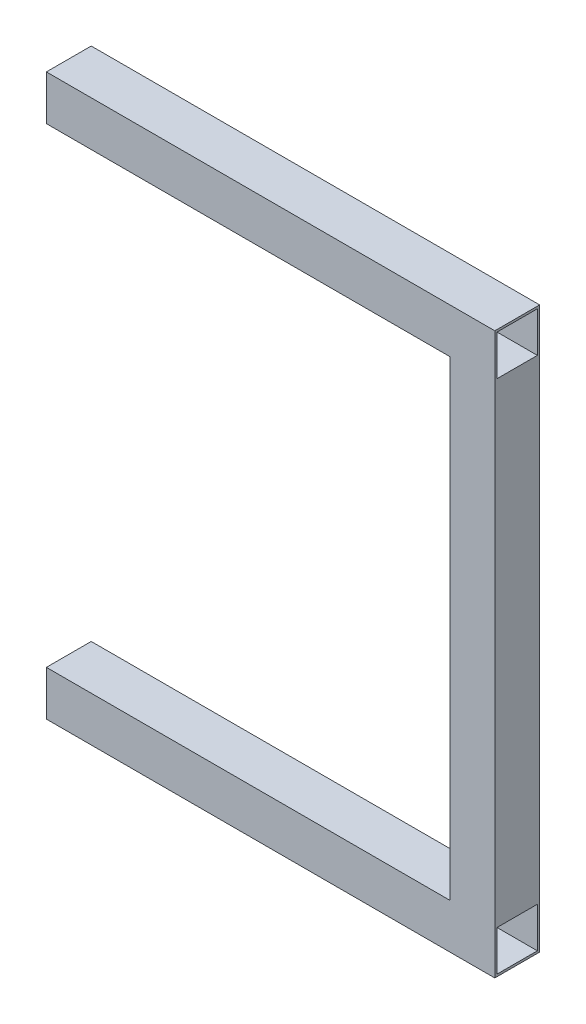
ISO-10303-21;
HEADER;
FILE_DESCRIPTION(('STEP AP214'),'2;1');
FILE_NAME('part.step','',(''),(''),'','','');
FILE_SCHEMA(('AUTOMOTIVE_DESIGN { 1 0 10303 214 1 1 1 1 }'));
ENDSEC;
DATA;
#1=APPLICATION_CONTEXT('core data for automotive mechanical design processes');
#2=APPLICATION_PROTOCOL_DEFINITION('international standard','automotive_design',2000,#1);
#3=PRODUCT_CONTEXT('',#1,'mechanical');
#4=PRODUCT('Part','Part','',(#3));
#5=PRODUCT_RELATED_PRODUCT_CATEGORY('part','',(#4));
#6=PRODUCT_DEFINITION_FORMATION('','',#4);
#7=PRODUCT_DEFINITION_CONTEXT('part definition',#1,'design');
#8=PRODUCT_DEFINITION('design','',#6,#7);
#9=PRODUCT_DEFINITION_SHAPE('','',#8);
#10=(LENGTH_UNIT() NAMED_UNIT(*) SI_UNIT(.MILLI.,.METRE.));
#11=(NAMED_UNIT(*) PLANE_ANGLE_UNIT() SI_UNIT($,.RADIAN.));
#12=(NAMED_UNIT(*) SI_UNIT($,.STERADIAN.) SOLID_ANGLE_UNIT());
#13=UNCERTAINTY_MEASURE_WITH_UNIT(LENGTH_MEASURE(1.E-05),#10,'distance_accuracy_value','');
#14=(GEOMETRIC_REPRESENTATION_CONTEXT(3) GLOBAL_UNCERTAINTY_ASSIGNED_CONTEXT((#13)) GLOBAL_UNIT_ASSIGNED_CONTEXT((#10,
#11,#12)) REPRESENTATION_CONTEXT('',''));
#15=CARTESIAN_POINT('',(0.,0.,0.));
#16=DIRECTION('',(0.,0.,1.));
#17=DIRECTION('',(1.,0.,0.));
#18=AXIS2_PLACEMENT_3D('',#15,#16,#17);
#19=CARTESIAN_POINT('',(400.000000000002,0.,40.));
#20=DIRECTION('',(0.,1.,0.));
#21=DIRECTION('',(0.,0.,1.));
#22=AXIS2_PLACEMENT_3D('',#19,#20,#21);
#23=PLANE('',#22);
#24=DIRECTION('',(1.,0.,0.));
#25=VECTOR('',#24,1.);
#26=CARTESIAN_POINT('',(400.000000000002,0.,0.));
#27=LINE('',#26,#25);
#28=CARTESIAN_POINT('',(0.,0.,0.));
#29=VERTEX_POINT('',#28);
#30=CARTESIAN_POINT('',(400.000000000002,0.,0.));
#31=VERTEX_POINT('',#30);
#32=EDGE_CURVE('E214',#29,#31,#27,.T.);
#33=ORIENTED_EDGE('',*,*,#32,.T.);
#34=DIRECTION('',(0.,0.,-1.));
#35=VECTOR('',#34,1.);
#36=CARTESIAN_POINT('',(400.000000000002,0.,40.));
#37=LINE('',#36,#35);
#38=CARTESIAN_POINT('',(400.000000000002,0.,40.));
#39=VERTEX_POINT('',#38);
#40=EDGE_CURVE('E11',#39,#31,#37,.T.);
#41=ORIENTED_EDGE('',*,*,#40,.F.);
#42=DIRECTION('',(1.,0.,0.));
#43=VECTOR('',#42,1.);
#44=CARTESIAN_POINT('',(400.000000000002,0.,40.));
#45=LINE('',#44,#43);
#46=CARTESIAN_POINT('',(0.,0.,40.));
#47=VERTEX_POINT('',#46);
#48=EDGE_CURVE('E215',#47,#39,#45,.T.);
#49=ORIENTED_EDGE('',*,*,#48,.F.);
#50=DIRECTION('',(0.,0.,-1.));
#51=VECTOR('',#50,1.);
#52=CARTESIAN_POINT('',(0.,0.,40.));
#53=LINE('',#52,#51);
#54=EDGE_CURVE('E233',#47,#29,#53,.T.);
#55=ORIENTED_EDGE('',*,*,#54,.T.);
#56=EDGE_LOOP('',(#33,#41,#49,#55));
#57=FACE_BOUND('',#56,.T.);
#58=ADVANCED_FACE('F33',(#57),#23,.F.);
#59=CARTESIAN_POINT('',(400.,500.,40.));
#60=DIRECTION('',(-1.,0.,0.));
#61=DIRECTION('',(0.,-1.,0.));
#62=AXIS2_PLACEMENT_3D('',#59,#60,#61);
#63=PLANE('',#62);
#64=DIRECTION('',(0.,0.,-1.));
#65=VECTOR('',#64,1.);
#66=CARTESIAN_POINT('',(400.000000000002,38.,40.));
#67=LINE('',#66,#65);
#68=CARTESIAN_POINT('',(400.000000000002,38.,38.));
#69=VERTEX_POINT('',#68);
#70=CARTESIAN_POINT('',(400.000000000002,38.,2.));
#71=VERTEX_POINT('',#70);
#72=EDGE_CURVE('E176',#69,#71,#67,.T.);
#73=ORIENTED_EDGE('',*,*,#72,.T.);
#74=DIRECTION('',(0.,-1.,0.));
#75=VECTOR('',#74,1.);
#76=CARTESIAN_POINT('',(400.,500.,1.99999999999995));
#77=LINE('',#76,#75);
#78=CARTESIAN_POINT('',(400.000000000002,2.,2.));
#79=VERTEX_POINT('',#78);
#80=EDGE_CURVE('E179',#71,#79,#77,.T.);
#81=ORIENTED_EDGE('',*,*,#80,.T.);
#82=DIRECTION('',(0.,0.,1.));
#83=VECTOR('',#82,1.);
#84=CARTESIAN_POINT('',(400.000000000002,2.,40.));
#85=LINE('',#84,#83);
#86=CARTESIAN_POINT('',(400.000000000002,2.,38.));
#87=VERTEX_POINT('',#86);
#88=EDGE_CURVE('E171',#79,#87,#85,.T.);
#89=ORIENTED_EDGE('',*,*,#88,.T.);
#90=DIRECTION('',(0.,1.,0.));
#91=VECTOR('',#90,1.);
#92=CARTESIAN_POINT('',(400.,500.,37.9999999999999));
#93=LINE('',#92,#91);
#94=EDGE_CURVE('E151',#87,#69,#93,.T.);
#95=ORIENTED_EDGE('',*,*,#94,.T.);
#96=EDGE_LOOP('',(#73,#81,#89,#95));
#97=FACE_BOUND('',#96,.T.);
#98=DIRECTION('',(0.,0.,-1.));
#99=VECTOR('',#98,1.);
#100=CARTESIAN_POINT('',(400.,498.,40.));
#101=LINE('',#100,#99);
#102=CARTESIAN_POINT('',(400.,498.,38.));
#103=VERTEX_POINT('',#102);
#104=CARTESIAN_POINT('',(400.,498.,2.));
#105=VERTEX_POINT('',#104);
#106=EDGE_CURVE('E208',#103,#105,#101,.T.);
#107=ORIENTED_EDGE('',*,*,#106,.T.);
#108=DIRECTION('',(0.,-1.,0.));
#109=VECTOR('',#108,1.);
#110=CARTESIAN_POINT('',(400.,500.,2.));
#111=LINE('',#110,#109);
#112=CARTESIAN_POINT('',(400.,462.,2.));
#113=VERTEX_POINT('',#112);
#114=EDGE_CURVE('E211',#105,#113,#111,.T.);
#115=ORIENTED_EDGE('',*,*,#114,.T.);
#116=DIRECTION('',(0.,0.,1.));
#117=VECTOR('',#116,1.);
#118=CARTESIAN_POINT('',(400.,462.,40.));
#119=LINE('',#118,#117);
#120=CARTESIAN_POINT('',(400.,462.,38.));
#121=VERTEX_POINT('',#120);
#122=EDGE_CURVE('E196',#113,#121,#119,.T.);
#123=ORIENTED_EDGE('',*,*,#122,.T.);
#124=DIRECTION('',(0.,1.,0.));
#125=VECTOR('',#124,1.);
#126=CARTESIAN_POINT('',(400.,500.,38.));
#127=LINE('',#126,#125);
#128=EDGE_CURVE('E205',#121,#103,#127,.T.);
#129=ORIENTED_EDGE('',*,*,#128,.T.);
#130=EDGE_LOOP('',(#107,#115,#123,#129));
#131=FACE_BOUND('',#130,.T.);
#132=DIRECTION('',(0.,1.,0.));
#133=VECTOR('',#132,1.);
#134=CARTESIAN_POINT('',(400.,500.,0.));
#135=LINE('',#134,#133);
#136=CARTESIAN_POINT('',(400.,500.,0.));
#137=VERTEX_POINT('',#136);
#138=EDGE_CURVE('E236',#31,#137,#135,.T.);
#139=ORIENTED_EDGE('',*,*,#138,.T.);
#140=DIRECTION('',(0.,0.,-1.));
#141=VECTOR('',#140,1.);
#142=CARTESIAN_POINT('',(400.,500.,40.));
#143=LINE('',#142,#141);
#144=CARTESIAN_POINT('',(400.,500.,40.));
#145=VERTEX_POINT('',#144);
#146=EDGE_CURVE('E40',#145,#137,#143,.T.);
#147=ORIENTED_EDGE('',*,*,#146,.F.);
#148=DIRECTION('',(0.,1.,0.));
#149=VECTOR('',#148,1.);
#150=CARTESIAN_POINT('',(400.,500.,40.));
#151=LINE('',#150,#149);
#152=EDGE_CURVE('E218',#39,#145,#151,.T.);
#153=ORIENTED_EDGE('',*,*,#152,.F.);
#154=ORIENTED_EDGE('',*,*,#40,.T.);
#155=EDGE_LOOP('',(#139,#147,#153,#154));
#156=FACE_BOUND('',#155,.T.);
#157=ADVANCED_FACE('F293',(#97,#131,#156),#63,.F.);
#158=CARTESIAN_POINT('',(0.,500.,40.));
#159=DIRECTION('',(0.,-1.,0.));
#160=DIRECTION('',(0.,0.,-1.));
#161=AXIS2_PLACEMENT_3D('',#158,#159,#160);
#162=PLANE('',#161);
#163=DIRECTION('',(-1.,0.,0.));
#164=VECTOR('',#163,1.);
#165=CARTESIAN_POINT('',(0.,500.,0.));
#166=LINE('',#165,#164);
#167=CARTESIAN_POINT('',(0.,500.,0.));
#168=VERTEX_POINT('',#167);
#169=EDGE_CURVE('E238',#137,#168,#166,.T.);
#170=ORIENTED_EDGE('',*,*,#169,.T.);
#171=DIRECTION('',(0.,0.,-1.));
#172=VECTOR('',#171,1.);
#173=CARTESIAN_POINT('',(0.,500.,40.));
#174=LINE('',#173,#172);
#175=CARTESIAN_POINT('',(0.,500.,40.));
#176=VERTEX_POINT('',#175);
#177=EDGE_CURVE('E263',#176,#168,#174,.T.);
#178=ORIENTED_EDGE('',*,*,#177,.F.);
#179=DIRECTION('',(-1.,0.,0.));
#180=VECTOR('',#179,1.);
#181=CARTESIAN_POINT('',(0.,500.,40.));
#182=LINE('',#181,#180);
#183=EDGE_CURVE('E221',#145,#176,#182,.T.);
#184=ORIENTED_EDGE('',*,*,#183,.F.);
#185=ORIENTED_EDGE('',*,*,#146,.T.);
#186=EDGE_LOOP('',(#170,#178,#184,#185));
#187=FACE_BOUND('',#186,.T.);
#188=ADVANCED_FACE('F270',(#187),#162,.F.);
#189=CARTESIAN_POINT('',(0.,460.,40.));
#190=DIRECTION('',(1.,0.,0.));
#191=DIRECTION('',(0.,0.,-1.));
#192=AXIS2_PLACEMENT_3D('',#189,#190,#191);
#193=PLANE('',#192);
#194=DIRECTION('',(0.,0.,1.));
#195=VECTOR('',#194,1.);
#196=CARTESIAN_POINT('',(0.,462.,2.));
#197=LINE('',#196,#195);
#198=CARTESIAN_POINT('',(0.,462.,2.00000000000001));
#199=VERTEX_POINT('',#198);
#200=CARTESIAN_POINT('',(0.,462.,38.));
#201=VERTEX_POINT('',#200);
#202=EDGE_CURVE('E184',#199,#201,#197,.T.);
#203=ORIENTED_EDGE('',*,*,#202,.F.);
#204=DIRECTION('',(0.,-1.,0.));
#205=VECTOR('',#204,1.);
#206=CARTESIAN_POINT('',(0.,498.,2.));
#207=LINE('',#206,#205);
#208=CARTESIAN_POINT('',(0.,498.,2.));
#209=VERTEX_POINT('',#208);
#210=EDGE_CURVE('E182',#209,#199,#207,.T.);
#211=ORIENTED_EDGE('',*,*,#210,.F.);
#212=DIRECTION('',(0.,0.,-1.));
#213=VECTOR('',#212,1.);
#214=CARTESIAN_POINT('',(0.,498.,2.));
#215=LINE('',#214,#213);
#216=CARTESIAN_POINT('',(0.,498.,38.));
#217=VERTEX_POINT('',#216);
#218=EDGE_CURVE('E190',#217,#209,#215,.T.);
#219=ORIENTED_EDGE('',*,*,#218,.F.);
#220=DIRECTION('',(0.,1.,0.));
#221=VECTOR('',#220,1.);
#222=CARTESIAN_POINT('',(0.,498.,38.));
#223=LINE('',#222,#221);
#224=EDGE_CURVE('E187',#201,#217,#223,.T.);
#225=ORIENTED_EDGE('',*,*,#224,.F.);
#226=EDGE_LOOP('',(#203,#211,#219,#225));
#227=FACE_BOUND('',#226,.T.);
#228=DIRECTION('',(0.,-1.,0.));
#229=VECTOR('',#228,1.);
#230=CARTESIAN_POINT('',(0.,460.,0.));
#231=LINE('',#230,#229);
#232=CARTESIAN_POINT('',(0.,460.,0.));
#233=VERTEX_POINT('',#232);
#234=EDGE_CURVE('E240',#168,#233,#231,.T.);
#235=ORIENTED_EDGE('',*,*,#234,.T.);
#236=DIRECTION('',(0.,0.,-1.));
#237=VECTOR('',#236,1.);
#238=CARTESIAN_POINT('',(0.,460.,40.));
#239=LINE('',#238,#237);
#240=CARTESIAN_POINT('',(0.,460.,40.));
#241=VERTEX_POINT('',#240);
#242=EDGE_CURVE('E260',#241,#233,#239,.T.);
#243=ORIENTED_EDGE('',*,*,#242,.F.);
#244=DIRECTION('',(0.,-1.,0.));
#245=VECTOR('',#244,1.);
#246=CARTESIAN_POINT('',(0.,460.,40.));
#247=LINE('',#246,#245);
#248=EDGE_CURVE('E223',#176,#241,#247,.T.);
#249=ORIENTED_EDGE('',*,*,#248,.F.);
#250=ORIENTED_EDGE('',*,*,#177,.T.);
#251=EDGE_LOOP('',(#235,#243,#249,#250));
#252=FACE_BOUND('',#251,.T.);
#253=ADVANCED_FACE('F281',(#227,#252),#193,.F.);
#254=CARTESIAN_POINT('',(360.,460.,40.));
#255=DIRECTION('',(0.,1.,0.));
#256=DIRECTION('',(0.,0.,1.));
#257=AXIS2_PLACEMENT_3D('',#254,#255,#256);
#258=PLANE('',#257);
#259=DIRECTION('',(1.,0.,0.));
#260=VECTOR('',#259,1.);
#261=CARTESIAN_POINT('',(360.,460.,0.));
#262=LINE('',#261,#260);
#263=CARTESIAN_POINT('',(360.,460.,0.));
#264=VERTEX_POINT('',#263);
#265=EDGE_CURVE('E242',#233,#264,#262,.T.);
#266=ORIENTED_EDGE('',*,*,#265,.T.);
#267=DIRECTION('',(0.,0.,-1.));
#268=VECTOR('',#267,1.);
#269=CARTESIAN_POINT('',(360.,460.,40.));
#270=LINE('',#269,#268);
#271=CARTESIAN_POINT('',(360.,460.,40.));
#272=VERTEX_POINT('',#271);
#273=EDGE_CURVE('E257',#272,#264,#270,.T.);
#274=ORIENTED_EDGE('',*,*,#273,.F.);
#275=DIRECTION('',(1.,0.,0.));
#276=VECTOR('',#275,1.);
#277=CARTESIAN_POINT('',(360.,460.,40.));
#278=LINE('',#277,#276);
#279=EDGE_CURVE('E225',#241,#272,#278,.T.);
#280=ORIENTED_EDGE('',*,*,#279,.F.);
#281=ORIENTED_EDGE('',*,*,#242,.T.);
#282=EDGE_LOOP('',(#266,#274,#280,#281));
#283=FACE_BOUND('',#282,.T.);
#284=ADVANCED_FACE('F285',(#283),#258,.F.);
#285=CARTESIAN_POINT('',(360.000000000002,40.,40.));
#286=DIRECTION('',(1.,0.,0.));
#287=DIRECTION('',(0.,1.,0.));
#288=AXIS2_PLACEMENT_3D('',#285,#286,#287);
#289=PLANE('',#288);
#290=DIRECTION('',(0.,-1.,0.));
#291=VECTOR('',#290,1.);
#292=CARTESIAN_POINT('',(360.000000000002,40.,0.));
#293=LINE('',#292,#291);
#294=CARTESIAN_POINT('',(360.000000000002,40.,0.));
#295=VERTEX_POINT('',#294);
#296=EDGE_CURVE('E244',#264,#295,#293,.T.);
#297=ORIENTED_EDGE('',*,*,#296,.T.);
#298=DIRECTION('',(0.,0.,-1.));
#299=VECTOR('',#298,1.);
#300=CARTESIAN_POINT('',(360.000000000002,40.,40.));
#301=LINE('',#300,#299);
#302=CARTESIAN_POINT('',(360.000000000002,40.,40.));
#303=VERTEX_POINT('',#302);
#304=EDGE_CURVE('E254',#303,#295,#301,.T.);
#305=ORIENTED_EDGE('',*,*,#304,.F.);
#306=DIRECTION('',(0.,-1.,0.));
#307=VECTOR('',#306,1.);
#308=CARTESIAN_POINT('',(360.000000000002,40.,40.));
#309=LINE('',#308,#307);
#310=EDGE_CURVE('E227',#272,#303,#309,.T.);
#311=ORIENTED_EDGE('',*,*,#310,.F.);
#312=ORIENTED_EDGE('',*,*,#273,.T.);
#313=EDGE_LOOP('',(#297,#305,#311,#312));
#314=FACE_BOUND('',#313,.T.);
#315=ADVANCED_FACE('F304',(#314),#289,.F.);
#316=CARTESIAN_POINT('',(0.,40.,40.));
#317=DIRECTION('',(0.,-1.,0.));
#318=DIRECTION('',(1.,0.,0.));
#319=AXIS2_PLACEMENT_3D('',#316,#317,#318);
#320=PLANE('',#319);
#321=DIRECTION('',(-1.,0.,0.));
#322=VECTOR('',#321,1.);
#323=CARTESIAN_POINT('',(0.,40.,0.));
#324=LINE('',#323,#322);
#325=CARTESIAN_POINT('',(0.,40.,0.));
#326=VERTEX_POINT('',#325);
#327=EDGE_CURVE('E246',#295,#326,#324,.T.);
#328=ORIENTED_EDGE('',*,*,#327,.T.);
#329=DIRECTION('',(0.,0.,-1.));
#330=VECTOR('',#329,1.);
#331=CARTESIAN_POINT('',(0.,40.,40.));
#332=LINE('',#331,#330);
#333=CARTESIAN_POINT('',(0.,40.,40.));
#334=VERTEX_POINT('',#333);
#335=EDGE_CURVE('E251',#334,#326,#332,.T.);
#336=ORIENTED_EDGE('',*,*,#335,.F.);
#337=DIRECTION('',(-1.,0.,0.));
#338=VECTOR('',#337,1.);
#339=CARTESIAN_POINT('',(0.,40.,40.));
#340=LINE('',#339,#338);
#341=EDGE_CURVE('E229',#303,#334,#340,.T.);
#342=ORIENTED_EDGE('',*,*,#341,.F.);
#343=ORIENTED_EDGE('',*,*,#304,.T.);
#344=EDGE_LOOP('',(#328,#336,#342,#343));
#345=FACE_BOUND('',#344,.T.);
#346=ADVANCED_FACE('F302',(#345),#320,.F.);
#347=CARTESIAN_POINT('',(0.,0.,40.));
#348=DIRECTION('',(1.,0.,0.));
#349=DIRECTION('',(0.,0.,-1.));
#350=AXIS2_PLACEMENT_3D('',#347,#348,#349);
#351=PLANE('',#350);
#352=DIRECTION('',(0.,0.,1.));
#353=VECTOR('',#352,1.);
#354=CARTESIAN_POINT('',(0.,2.,2.));
#355=LINE('',#354,#353);
#356=CARTESIAN_POINT('',(0.,2.,2.00000000000001));
#357=VERTEX_POINT('',#356);
#358=CARTESIAN_POINT('',(0.,2.,38.));
#359=VERTEX_POINT('',#358);
#360=EDGE_CURVE('E157',#357,#359,#355,.T.);
#361=ORIENTED_EDGE('',*,*,#360,.F.);
#362=DIRECTION('',(0.,-1.,0.));
#363=VECTOR('',#362,1.);
#364=CARTESIAN_POINT('',(0.,38.,2.));
#365=LINE('',#364,#363);
#366=CARTESIAN_POINT('',(0.,38.,2.));
#367=VERTEX_POINT('',#366);
#368=EDGE_CURVE('E55',#367,#357,#365,.T.);
#369=ORIENTED_EDGE('',*,*,#368,.F.);
#370=DIRECTION('',(0.,0.,-1.));
#371=VECTOR('',#370,1.);
#372=CARTESIAN_POINT('',(0.,38.,2.));
#373=LINE('',#372,#371);
#374=CARTESIAN_POINT('',(0.,38.,38.));
#375=VERTEX_POINT('',#374);
#376=EDGE_CURVE('E164',#375,#367,#373,.T.);
#377=ORIENTED_EDGE('',*,*,#376,.F.);
#378=DIRECTION('',(0.,1.,0.));
#379=VECTOR('',#378,1.);
#380=CARTESIAN_POINT('',(0.,38.,38.));
#381=LINE('',#380,#379);
#382=EDGE_CURVE('E148',#359,#375,#381,.T.);
#383=ORIENTED_EDGE('',*,*,#382,.F.);
#384=EDGE_LOOP('',(#361,#369,#377,#383));
#385=FACE_BOUND('',#384,.T.);
#386=DIRECTION('',(0.,-1.,0.));
#387=VECTOR('',#386,1.);
#388=CARTESIAN_POINT('',(0.,0.,0.));
#389=LINE('',#388,#387);
#390=EDGE_CURVE('E219',#326,#29,#389,.T.);
#391=ORIENTED_EDGE('',*,*,#390,.T.);
#392=ORIENTED_EDGE('',*,*,#54,.F.);
#393=DIRECTION('',(0.,-1.,0.));
#394=VECTOR('',#393,1.);
#395=CARTESIAN_POINT('',(0.,0.,40.));
#396=LINE('',#395,#394);
#397=EDGE_CURVE('E231',#334,#47,#396,.T.);
#398=ORIENTED_EDGE('',*,*,#397,.F.);
#399=ORIENTED_EDGE('',*,*,#335,.T.);
#400=EDGE_LOOP('',(#391,#392,#398,#399));
#401=FACE_BOUND('',#400,.T.);
#402=ADVANCED_FACE('F161',(#385,#401),#351,.F.);
#403=CARTESIAN_POINT('',(0.,0.,40.));
#404=DIRECTION('',(0.,0.,-1.));
#405=DIRECTION('',(-1.,0.,0.));
#406=AXIS2_PLACEMENT_3D('',#403,#404,#405);
#407=PLANE('',#406);
#408=ORIENTED_EDGE('',*,*,#48,.T.);
#409=ORIENTED_EDGE('',*,*,#152,.T.);
#410=ORIENTED_EDGE('',*,*,#183,.T.);
#411=ORIENTED_EDGE('',*,*,#248,.T.);
#412=ORIENTED_EDGE('',*,*,#279,.T.);
#413=ORIENTED_EDGE('',*,*,#310,.T.);
#414=ORIENTED_EDGE('',*,*,#341,.T.);
#415=ORIENTED_EDGE('',*,*,#397,.T.);
#416=EDGE_LOOP('',(#408,#409,#410,#411,#412,#413,#414,#415));
#417=FACE_BOUND('',#416,.T.);
#418=ADVANCED_FACE('F289',(#417),#407,.F.);
#419=CARTESIAN_POINT('',(0.,0.,0.));
#420=DIRECTION('',(0.,0.,-1.));
#421=DIRECTION('',(-1.,0.,0.));
#422=AXIS2_PLACEMENT_3D('',#419,#420,#421);
#423=PLANE('',#422);
#424=ORIENTED_EDGE('',*,*,#32,.F.);
#425=ORIENTED_EDGE('',*,*,#390,.F.);
#426=ORIENTED_EDGE('',*,*,#327,.F.);
#427=ORIENTED_EDGE('',*,*,#296,.F.);
#428=ORIENTED_EDGE('',*,*,#265,.F.);
#429=ORIENTED_EDGE('',*,*,#234,.F.);
#430=ORIENTED_EDGE('',*,*,#169,.F.);
#431=ORIENTED_EDGE('',*,*,#138,.F.);
#432=EDGE_LOOP('',(#424,#425,#426,#427,#428,#429,#430,#431));
#433=FACE_BOUND('',#432,.T.);
#434=ADVANCED_FACE('F276',(#433),#423,.T.);
#435=CARTESIAN_POINT('',(448.,498.,2.));
#436=DIRECTION('',(0.,0.,-1.));
#437=DIRECTION('',(0.,1.,0.));
#438=AXIS2_PLACEMENT_3D('',#435,#436,#437);
#439=PLANE('',#438);
#440=DIRECTION('',(-1.,0.,0.));
#441=VECTOR('',#440,1.);
#442=CARTESIAN_POINT('',(448.,498.,2.));
#443=LINE('',#442,#441);
#444=EDGE_CURVE('E194',#105,#209,#443,.T.);
#445=ORIENTED_EDGE('',*,*,#444,.T.);
#446=ORIENTED_EDGE('',*,*,#210,.T.);
#447=DIRECTION('',(-1.,0.,0.));
#448=VECTOR('',#447,1.);
#449=CARTESIAN_POINT('',(448.,462.,2.));
#450=LINE('',#449,#448);
#451=EDGE_CURVE('E193',#113,#199,#450,.T.);
#452=ORIENTED_EDGE('',*,*,#451,.F.);
#453=ORIENTED_EDGE('',*,*,#114,.F.);
#454=EDGE_LOOP('',(#445,#446,#452,#453));
#455=FACE_BOUND('',#454,.T.);
#456=ADVANCED_FACE('F337',(#455),#439,.F.);
#457=CARTESIAN_POINT('',(448.,498.,2.));
#458=DIRECTION('',(0.,1.,0.));
#459=DIRECTION('',(0.,0.,1.));
#460=AXIS2_PLACEMENT_3D('',#457,#458,#459);
#461=PLANE('',#460);
#462=DIRECTION('',(-1.,0.,0.));
#463=VECTOR('',#462,1.);
#464=CARTESIAN_POINT('',(448.,498.,38.));
#465=LINE('',#464,#463);
#466=EDGE_CURVE('E197',#103,#217,#465,.T.);
#467=ORIENTED_EDGE('',*,*,#466,.T.);
#468=ORIENTED_EDGE('',*,*,#218,.T.);
#469=ORIENTED_EDGE('',*,*,#444,.F.);
#470=ORIENTED_EDGE('',*,*,#106,.F.);
#471=EDGE_LOOP('',(#467,#468,#469,#470));
#472=FACE_BOUND('',#471,.T.);
#473=ADVANCED_FACE('F341',(#472),#461,.F.);
#474=CARTESIAN_POINT('',(448.,498.,38.));
#475=DIRECTION('',(0.,0.,1.));
#476=DIRECTION('',(0.,-1.,0.));
#477=AXIS2_PLACEMENT_3D('',#474,#475,#476);
#478=PLANE('',#477);
#479=DIRECTION('',(-1.,0.,0.));
#480=VECTOR('',#479,1.);
#481=CARTESIAN_POINT('',(448.,462.,38.));
#482=LINE('',#481,#480);
#483=EDGE_CURVE('E199',#121,#201,#482,.T.);
#484=ORIENTED_EDGE('',*,*,#483,.T.);
#485=ORIENTED_EDGE('',*,*,#224,.T.);
#486=ORIENTED_EDGE('',*,*,#466,.F.);
#487=ORIENTED_EDGE('',*,*,#128,.F.);
#488=EDGE_LOOP('',(#484,#485,#486,#487));
#489=FACE_BOUND('',#488,.T.);
#490=ADVANCED_FACE('F343',(#489),#478,.F.);
#491=CARTESIAN_POINT('',(448.,462.,2.));
#492=DIRECTION('',(0.,-1.,0.));
#493=DIRECTION('',(0.,0.,-1.));
#494=AXIS2_PLACEMENT_3D('',#491,#492,#493);
#495=PLANE('',#494);
#496=ORIENTED_EDGE('',*,*,#451,.T.);
#497=ORIENTED_EDGE('',*,*,#202,.T.);
#498=ORIENTED_EDGE('',*,*,#483,.F.);
#499=ORIENTED_EDGE('',*,*,#122,.F.);
#500=EDGE_LOOP('',(#496,#497,#498,#499));
#501=FACE_BOUND('',#500,.T.);
#502=ADVANCED_FACE('F333',(#501),#495,.F.);
#503=CARTESIAN_POINT('',(448.,38.,2.));
#504=DIRECTION('',(0.,0.,-1.));
#505=DIRECTION('',(0.,1.,0.));
#506=AXIS2_PLACEMENT_3D('',#503,#504,#505);
#507=PLANE('',#506);
#508=DIRECTION('',(-1.,0.,0.));
#509=VECTOR('',#508,1.);
#510=CARTESIAN_POINT('',(448.,38.,2.));
#511=LINE('',#510,#509);
#512=EDGE_CURVE('E169',#71,#367,#511,.T.);
#513=ORIENTED_EDGE('',*,*,#512,.T.);
#514=ORIENTED_EDGE('',*,*,#368,.T.);
#515=DIRECTION('',(-1.,0.,0.));
#516=VECTOR('',#515,1.);
#517=CARTESIAN_POINT('',(448.,2.,2.));
#518=LINE('',#517,#516);
#519=EDGE_CURVE('E154',#79,#357,#518,.T.);
#520=ORIENTED_EDGE('',*,*,#519,.F.);
#521=ORIENTED_EDGE('',*,*,#80,.F.);
#522=EDGE_LOOP('',(#513,#514,#520,#521));
#523=FACE_BOUND('',#522,.T.);
#524=ADVANCED_FACE('F350',(#523),#507,.F.);
#525=CARTESIAN_POINT('',(448.,38.,2.));
#526=DIRECTION('',(0.,1.,0.));
#527=DIRECTION('',(0.,0.,1.));
#528=AXIS2_PLACEMENT_3D('',#525,#526,#527);
#529=PLANE('',#528);
#530=DIRECTION('',(-1.,0.,0.));
#531=VECTOR('',#530,1.);
#532=CARTESIAN_POINT('',(448.,38.,38.));
#533=LINE('',#532,#531);
#534=EDGE_CURVE('E153',#69,#375,#533,.T.);
#535=ORIENTED_EDGE('',*,*,#534,.T.);
#536=ORIENTED_EDGE('',*,*,#376,.T.);
#537=ORIENTED_EDGE('',*,*,#512,.F.);
#538=ORIENTED_EDGE('',*,*,#72,.F.);
#539=EDGE_LOOP('',(#535,#536,#537,#538));
#540=FACE_BOUND('',#539,.T.);
#541=ADVANCED_FACE('F441',(#540),#529,.F.);
#542=CARTESIAN_POINT('',(448.,38.,38.));
#543=DIRECTION('',(0.,0.,1.));
#544=DIRECTION('',(0.,-1.,0.));
#545=AXIS2_PLACEMENT_3D('',#542,#543,#544);
#546=PLANE('',#545);
#547=DIRECTION('',(-1.,0.,0.));
#548=VECTOR('',#547,1.);
#549=CARTESIAN_POINT('',(448.,2.,38.));
#550=LINE('',#549,#548);
#551=EDGE_CURVE('E47',#87,#359,#550,.T.);
#552=ORIENTED_EDGE('',*,*,#551,.T.);
#553=ORIENTED_EDGE('',*,*,#382,.T.);
#554=ORIENTED_EDGE('',*,*,#534,.F.);
#555=ORIENTED_EDGE('',*,*,#94,.F.);
#556=EDGE_LOOP('',(#552,#553,#554,#555));
#557=FACE_BOUND('',#556,.T.);
#558=ADVANCED_FACE('F145',(#557),#546,.F.);
#559=CARTESIAN_POINT('',(448.,2.,2.));
#560=DIRECTION('',(0.,-1.,0.));
#561=DIRECTION('',(0.,0.,-1.));
#562=AXIS2_PLACEMENT_3D('',#559,#560,#561);
#563=PLANE('',#562);
#564=ORIENTED_EDGE('',*,*,#519,.T.);
#565=ORIENTED_EDGE('',*,*,#360,.T.);
#566=ORIENTED_EDGE('',*,*,#551,.F.);
#567=ORIENTED_EDGE('',*,*,#88,.F.);
#568=EDGE_LOOP('',(#564,#565,#566,#567));
#569=FACE_BOUND('',#568,.T.);
#570=ADVANCED_FACE('F158',(#569),#563,.F.);
#571=CLOSED_SHELL('',(#58,#157,#188,#253,#284,#315,#346,#402,#418,#434,#456,#473,#490,#502,#524,
#541,#558,#570));
#572=MANIFOLD_SOLID_BREP('B2',#571);
#573=ADVANCED_BREP_SHAPE_REPRESENTATION('',(#18,#572),#14);
#574=SHAPE_DEFINITION_REPRESENTATION(#9,#573);
ENDSEC;
END-ISO-10303-21;
